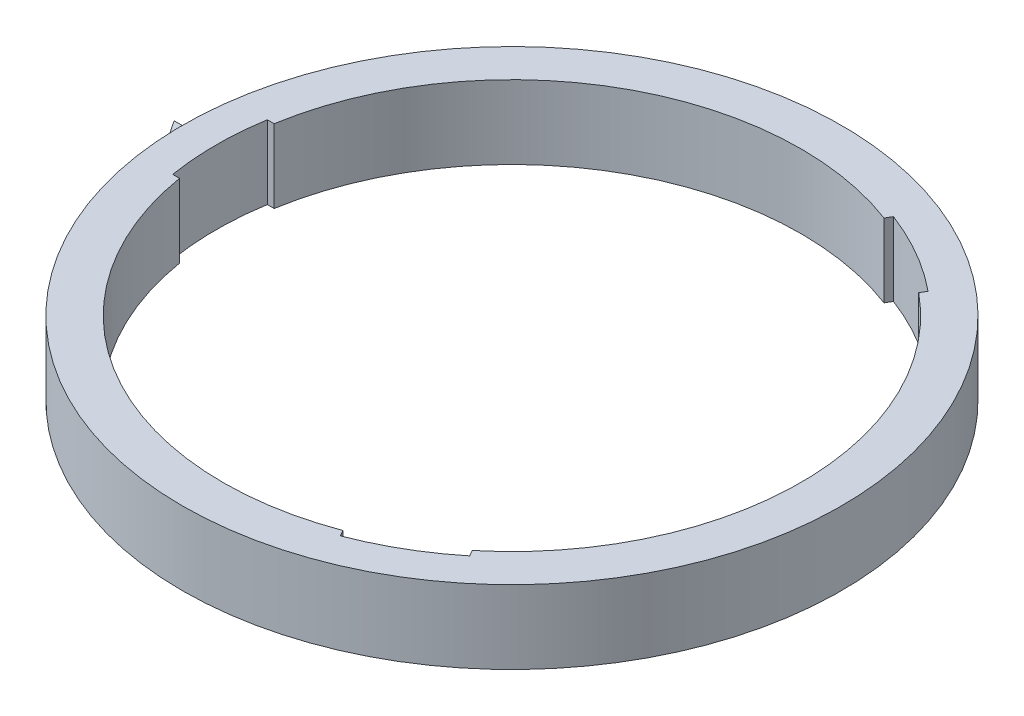
ISO-10303-21;
HEADER;
FILE_DESCRIPTION(('STEP AP214'),'2;1');
FILE_NAME('part.step','',(''),(''),'','','');
FILE_SCHEMA(('AUTOMOTIVE_DESIGN { 1 0 10303 214 1 1 1 1 }'));
ENDSEC;
DATA;
#1=APPLICATION_CONTEXT('core data for automotive mechanical design processes');
#2=APPLICATION_PROTOCOL_DEFINITION('international standard','automotive_design',2000,#1);
#3=PRODUCT_CONTEXT('',#1,'mechanical');
#4=PRODUCT('Part','Part','',(#3));
#5=PRODUCT_RELATED_PRODUCT_CATEGORY('part','',(#4));
#6=PRODUCT_DEFINITION_FORMATION('','',#4);
#7=PRODUCT_DEFINITION_CONTEXT('part definition',#1,'design');
#8=PRODUCT_DEFINITION('design','',#6,#7);
#9=PRODUCT_DEFINITION_SHAPE('','',#8);
#10=(LENGTH_UNIT() NAMED_UNIT(*) SI_UNIT(.MILLI.,.METRE.));
#11=(NAMED_UNIT(*) PLANE_ANGLE_UNIT() SI_UNIT($,.RADIAN.));
#12=(NAMED_UNIT(*) SI_UNIT($,.STERADIAN.) SOLID_ANGLE_UNIT());
#13=UNCERTAINTY_MEASURE_WITH_UNIT(LENGTH_MEASURE(1.E-05),#10,'distance_accuracy_value','');
#14=(GEOMETRIC_REPRESENTATION_CONTEXT(3) GLOBAL_UNCERTAINTY_ASSIGNED_CONTEXT((#13)) GLOBAL_UNIT_ASSIGNED_CONTEXT((#10,
#11,#12)) REPRESENTATION_CONTEXT('',''));
#15=CARTESIAN_POINT('',(0.,0.,0.));
#16=DIRECTION('',(0.,0.,1.));
#17=DIRECTION('',(1.,0.,0.));
#18=AXIS2_PLACEMENT_3D('',#15,#16,#17);
#19=CARTESIAN_POINT('',(0.,4.34782608695652,0.));
#20=DIRECTION('',(0.,-1.,0.));
#21=DIRECTION('',(0.,0.,-1.));
#22=AXIS2_PLACEMENT_3D('',#19,#20,#21);
#23=CYLINDRICAL_SURFACE('',#22,17.1);
#24=DIRECTION('',(0.,-1.,0.));
#25=VECTOR('',#24,1.);
#26=CARTESIAN_POINT('',(-16.8692027078935,4.34782608695652,-2.8));
#27=LINE('',#26,#25);
#28=CARTESIAN_POINT('',(-16.8692027078935,0.,-2.8));
#29=VERTEX_POINT('',#28);
#30=CARTESIAN_POINT('',(-16.8692027078935,4.34782608695652,-2.8));
#31=VERTEX_POINT('',#30);
#32=EDGE_CURVE('E11',#29,#31,#27,.F.);
#33=ORIENTED_EDGE('',*,*,#32,.F.);
#34=CARTESIAN_POINT('',(0.,0.,0.));
#35=DIRECTION('',(0.,1.,0.));
#36=DIRECTION('',(0.,0.,1.));
#37=AXIS2_PLACEMENT_3D('',#34,#35,#36);
#38=CIRCLE('',#37,17.1);
#39=CARTESIAN_POINT('',(6.0097302233503,0.,-16.009158086625));
#40=VERTEX_POINT('',#39);
#41=EDGE_CURVE('E246',#40,#29,#38,.T.);
#42=ORIENTED_EDGE('',*,*,#41,.F.);
#43=DIRECTION('',(0.,-1.,0.));
#44=VECTOR('',#43,1.);
#45=CARTESIAN_POINT('',(6.0097302233503,4.34782608695652,-16.009158086625));
#46=LINE('',#45,#44);
#47=CARTESIAN_POINT('',(6.0097302233503,4.34782608695652,-16.009158086625));
#48=VERTEX_POINT('',#47);
#49=EDGE_CURVE('E295',#48,#40,#46,.T.);
#50=ORIENTED_EDGE('',*,*,#49,.F.);
#51=CARTESIAN_POINT('',(0.,4.34782608695652,0.));
#52=DIRECTION('',(0.,1.,0.));
#53=DIRECTION('',(0.,0.,1.));
#54=AXIS2_PLACEMENT_3D('',#51,#52,#53);
#55=CIRCLE('',#54,17.1);
#56=EDGE_CURVE('E242',#48,#31,#55,.T.);
#57=ORIENTED_EDGE('',*,*,#56,.T.);
#58=EDGE_LOOP('',(#33,#42,#50,#57));
#59=FACE_BOUND('',#58,.T.);
#60=ADVANCED_FACE('F34',(#59),#23,.F.);
#61=DIRECTION('',(0.,-1.,0.));
#62=VECTOR('',#61,1.);
#63=CARTESIAN_POINT('',(10.8594724845432,4.34782608695652,-13.209158086625));
#64=LINE('',#63,#62);
#65=CARTESIAN_POINT('',(10.8594724845432,0.,-13.209158086625));
#66=VERTEX_POINT('',#65);
#67=CARTESIAN_POINT('',(10.8594724845432,4.34782608695652,-13.209158086625));
#68=VERTEX_POINT('',#67);
#69=EDGE_CURVE('E297',#66,#68,#64,.F.);
#70=ORIENTED_EDGE('',*,*,#69,.F.);
#71=CARTESIAN_POINT('',(10.8594724845432,0.,13.209158086625));
#72=VERTEX_POINT('',#71);
#73=EDGE_CURVE('E243',#72,#66,#38,.T.);
#74=ORIENTED_EDGE('',*,*,#73,.F.);
#75=DIRECTION('',(0.,-1.,0.));
#76=VECTOR('',#75,1.);
#77=CARTESIAN_POINT('',(10.8594724845432,4.34782608695652,13.209158086625));
#78=LINE('',#77,#76);
#79=CARTESIAN_POINT('',(10.8594724845432,4.34782608695652,13.209158086625));
#80=VERTEX_POINT('',#79);
#81=EDGE_CURVE('E283',#80,#72,#78,.T.);
#82=ORIENTED_EDGE('',*,*,#81,.F.);
#83=EDGE_CURVE('E244',#80,#68,#55,.T.);
#84=ORIENTED_EDGE('',*,*,#83,.T.);
#85=EDGE_LOOP('',(#70,#74,#82,#84));
#86=FACE_BOUND('',#85,.T.);
#87=ADVANCED_FACE('F314',(#86),#23,.F.);
#88=CARTESIAN_POINT('',(0.,4.34782608695652,0.));
#89=DIRECTION('',(0.,-1.,0.));
#90=DIRECTION('',(0.,0.,-1.));
#91=AXIS2_PLACEMENT_3D('',#88,#89,#90);
#92=CYLINDRICAL_SURFACE('',#91,19.5);
#93=CARTESIAN_POINT('',(0.,0.,0.));
#94=DIRECTION('',(0.,1.,0.));
#95=DIRECTION('',(0.,0.,1.));
#96=AXIS2_PLACEMENT_3D('',#93,#94,#95);
#97=CIRCLE('',#96,19.5);
#98=CARTESIAN_POINT('',(0.,0.,19.5));
#99=VERTEX_POINT('',#98);
#100=EDGE_CURVE('E251',#99,#99,#97,.T.);
#101=ORIENTED_EDGE('',*,*,#100,.T.);
#102=EDGE_LOOP('',(#101));
#103=FACE_BOUND('',#102,.T.);
#104=CARTESIAN_POINT('',(0.,4.34782608695652,0.));
#105=DIRECTION('',(0.,1.,0.));
#106=DIRECTION('',(0.,0.,1.));
#107=AXIS2_PLACEMENT_3D('',#104,#105,#106);
#108=CIRCLE('',#107,19.5);
#109=CARTESIAN_POINT('',(0.,4.34782608695652,19.5));
#110=VERTEX_POINT('',#109);
#111=EDGE_CURVE('E247',#110,#110,#108,.T.);
#112=ORIENTED_EDGE('',*,*,#111,.F.);
#113=EDGE_LOOP('',(#112));
#114=FACE_BOUND('',#113,.T.);
#115=CARTESIAN_POINT('',(0.,4.33854182700951,0.));
#116=DIRECTION('',(0.,-0.448746127925553,0.893659282205373));
#117=DIRECTION('',(0.,-0.893659282205373,-0.448746127925553));
#118=AXIS2_PLACEMENT_3D('',#115,#116,#117);
#119=ELLIPSE('',#118,43.4544139470214,19.5);
#120=CARTESIAN_POINT('',(-19.5,4.33854182700951,0.));
#121=VERTEX_POINT('',#120);
#122=CARTESIAN_POINT('',(-19.4696822141464,2.17391304347826,-1.08695652173914));
#123=VERTEX_POINT('',#122);
#124=EDGE_CURVE('E262',#121,#123,#119,.T.);
#125=ORIENTED_EDGE('',*,*,#124,.F.);
#126=CARTESIAN_POINT('',(0.,4.33854182700951,0.));
#127=DIRECTION('',(0.,-0.448746127925553,-0.893659282205373));
#128=DIRECTION('',(0.,-0.893659282205373,0.448746127925553));
#129=AXIS2_PLACEMENT_3D('',#126,#127,#128);
#130=ELLIPSE('',#129,43.4544139470214,19.5);
#131=CARTESIAN_POINT('',(-19.4696822141464,2.17391304347826,1.08695652173914));
#132=VERTEX_POINT('',#131);
#133=EDGE_CURVE('E250',#132,#121,#130,.T.);
#134=ORIENTED_EDGE('',*,*,#133,.F.);
#135=CARTESIAN_POINT('',(0.,0.00928425994700752,0.));
#136=DIRECTION('',(0.,0.448746127925553,-0.893659282205373));
#137=DIRECTION('',(0.,-0.893659282205373,-0.448746127925553));
#138=AXIS2_PLACEMENT_3D('',#135,#136,#137);
#139=ELLIPSE('',#138,43.4544139470214,19.5);
#140=CARTESIAN_POINT('',(-19.5,0.00928425994700806,0.));
#141=VERTEX_POINT('',#140);
#142=EDGE_CURVE('E256',#141,#132,#139,.T.);
#143=ORIENTED_EDGE('',*,*,#142,.F.);
#144=CARTESIAN_POINT('',(0.,0.00928425994700839,0.));
#145=DIRECTION('',(0.,0.448746127925553,0.893659282205373));
#146=DIRECTION('',(0.,-0.893659282205373,0.448746127925553));
#147=AXIS2_PLACEMENT_3D('',#144,#145,#146);
#148=ELLIPSE('',#147,43.4544139470214,19.5);
#149=EDGE_CURVE('E259',#123,#141,#148,.T.);
#150=ORIENTED_EDGE('',*,*,#149,.F.);
#151=EDGE_LOOP('',(#125,#134,#143,#150));
#152=FACE_BOUND('',#151,.T.);
#153=ADVANCED_FACE('F337',(#103,#114,#152),#92,.T.);
#154=CARTESIAN_POINT('',(0.,4.34782608695652,0.));
#155=DIRECTION('',(0.,1.,0.));
#156=DIRECTION('',(0.,0.,1.));
#157=AXIS2_PLACEMENT_3D('',#154,#155,#156);
#158=PLANE('',#157);
#159=DIRECTION('',(-1.,0.,0.));
#160=VECTOR('',#159,1.);
#161=CARTESIAN_POINT('',(-17.2745477509543,4.34782608695652,-2.8));
#162=LINE('',#161,#160);
#163=CARTESIAN_POINT('',(-17.2745477509543,4.34782608695652,-2.8));
#164=VERTEX_POINT('',#163);
#165=EDGE_CURVE('E179',#31,#164,#162,.T.);
#166=ORIENTED_EDGE('',*,*,#165,.F.);
#167=ORIENTED_EDGE('',*,*,#56,.F.);
#168=DIRECTION('',(-0.5,0.,0.866025403784439));
#169=VECTOR('',#168,1.);
#170=CARTESIAN_POINT('',(6.21240274488071,4.34782608695652,-16.3601971912138));
#171=LINE('',#170,#169);
#172=CARTESIAN_POINT('',(6.21240274488071,4.34782608695652,-16.3601971912138));
#173=VERTEX_POINT('',#172);
#174=EDGE_CURVE('E57',#173,#48,#171,.T.);
#175=ORIENTED_EDGE('',*,*,#174,.F.);
#176=CARTESIAN_POINT('',(0.,4.34782608695652,0.));
#177=DIRECTION('',(0.,1.,0.));
#178=DIRECTION('',(0.,0.,1.));
#179=AXIS2_PLACEMENT_3D('',#176,#177,#178);
#180=CIRCLE('',#179,17.5);
#181=CARTESIAN_POINT('',(11.0621450060736,4.34782608695652,-13.5601971912138));
#182=VERTEX_POINT('',#181);
#183=EDGE_CURVE('E200',#182,#173,#180,.T.);
#184=ORIENTED_EDGE('',*,*,#183,.F.);
#185=DIRECTION('',(0.5,0.,-0.866025403784439));
#186=VECTOR('',#185,1.);
#187=CARTESIAN_POINT('',(11.0621450060736,4.34782608695652,-13.5601971912138));
#188=LINE('',#187,#186);
#189=EDGE_CURVE('E193',#68,#182,#188,.T.);
#190=ORIENTED_EDGE('',*,*,#189,.F.);
#191=ORIENTED_EDGE('',*,*,#83,.F.);
#192=DIRECTION('',(-0.5,0.,-0.866025403784439));
#193=VECTOR('',#192,1.);
#194=CARTESIAN_POINT('',(11.0621450060736,4.34782608695652,13.5601971912138));
#195=LINE('',#194,#193);
#196=CARTESIAN_POINT('',(11.0621450060736,4.34782608695652,13.5601971912138));
#197=VERTEX_POINT('',#196);
#198=EDGE_CURVE('E223',#197,#80,#195,.T.);
#199=ORIENTED_EDGE('',*,*,#198,.F.);
#200=CARTESIAN_POINT('',(0.,4.34782608695652,0.));
#201=DIRECTION('',(0.,1.,0.));
#202=DIRECTION('',(0.,0.,1.));
#203=AXIS2_PLACEMENT_3D('',#200,#201,#202);
#204=CIRCLE('',#203,17.5);
#205=CARTESIAN_POINT('',(6.21240274488073,4.34782608695652,16.3601971912138));
#206=VERTEX_POINT('',#205);
#207=EDGE_CURVE('E220',#206,#197,#204,.T.);
#208=ORIENTED_EDGE('',*,*,#207,.F.);
#209=DIRECTION('',(0.5,0.,0.866025403784439));
#210=VECTOR('',#209,1.);
#211=CARTESIAN_POINT('',(6.21240274488073,4.34782608695652,16.3601971912138));
#212=LINE('',#211,#210);
#213=CARTESIAN_POINT('',(6.00973022335031,4.34782608695652,16.009158086625));
#214=VERTEX_POINT('',#213);
#215=EDGE_CURVE('E213',#214,#206,#212,.T.);
#216=ORIENTED_EDGE('',*,*,#215,.F.);
#217=CARTESIAN_POINT('',(-16.8692027078935,4.34782608695652,2.8));
#218=VERTEX_POINT('',#217);
#219=EDGE_CURVE('E239',#218,#214,#55,.T.);
#220=ORIENTED_EDGE('',*,*,#219,.F.);
#221=DIRECTION('',(1.,0.,0.));
#222=VECTOR('',#221,1.);
#223=CARTESIAN_POINT('',(-17.2745477509543,4.34782608695652,2.8));
#224=LINE('',#223,#222);
#225=CARTESIAN_POINT('',(-17.2745477509543,4.34782608695652,2.8));
#226=VERTEX_POINT('',#225);
#227=EDGE_CURVE('E49',#226,#218,#224,.T.);
#228=ORIENTED_EDGE('',*,*,#227,.F.);
#229=CARTESIAN_POINT('',(0.,4.34782608695652,0.));
#230=DIRECTION('',(0.,1.,0.));
#231=DIRECTION('',(0.,0.,1.));
#232=AXIS2_PLACEMENT_3D('',#229,#230,#231);
#233=CIRCLE('',#232,17.5);
#234=EDGE_CURVE('E166',#164,#226,#233,.T.);
#235=ORIENTED_EDGE('',*,*,#234,.F.);
#236=EDGE_LOOP('',(#166,#167,#175,#184,#190,#191,#199,#208,#216,#220,#228,#235));
#237=FACE_BOUND('',#236,.T.);
#238=ORIENTED_EDGE('',*,*,#111,.T.);
#239=EDGE_LOOP('',(#238));
#240=FACE_BOUND('',#239,.T.);
#241=ADVANCED_FACE('F310',(#237,#240),#158,.T.);
#242=CARTESIAN_POINT('',(0.,0.,0.));
#243=DIRECTION('',(0.,1.,0.));
#244=DIRECTION('',(0.,0.,1.));
#245=AXIS2_PLACEMENT_3D('',#242,#243,#244);
#246=PLANE('',#245);
#247=ORIENTED_EDGE('',*,*,#100,.F.);
#248=EDGE_LOOP('',(#247));
#249=FACE_BOUND('',#248,.T.);
#250=ORIENTED_EDGE('',*,*,#41,.T.);
#251=DIRECTION('',(-1.,0.,0.));
#252=VECTOR('',#251,1.);
#253=CARTESIAN_POINT('',(-17.2745477509543,0.,-2.8));
#254=LINE('',#253,#252);
#255=CARTESIAN_POINT('',(-17.2745477509543,0.,-2.8));
#256=VERTEX_POINT('',#255);
#257=EDGE_CURVE('E168',#29,#256,#254,.T.);
#258=ORIENTED_EDGE('',*,*,#257,.T.);
#259=CARTESIAN_POINT('',(0.,0.,0.));
#260=DIRECTION('',(0.,1.,0.));
#261=DIRECTION('',(0.,0.,1.));
#262=AXIS2_PLACEMENT_3D('',#259,#260,#261);
#263=CIRCLE('',#262,17.5);
#264=CARTESIAN_POINT('',(-17.2745477509543,0.,2.8));
#265=VERTEX_POINT('',#264);
#266=EDGE_CURVE('E163',#256,#265,#263,.T.);
#267=ORIENTED_EDGE('',*,*,#266,.T.);
#268=DIRECTION('',(1.,0.,0.));
#269=VECTOR('',#268,1.);
#270=CARTESIAN_POINT('',(-17.2745477509543,0.,2.8));
#271=LINE('',#270,#269);
#272=CARTESIAN_POINT('',(-16.8692027078935,0.,2.8));
#273=VERTEX_POINT('',#272);
#274=EDGE_CURVE('E171',#265,#273,#271,.T.);
#275=ORIENTED_EDGE('',*,*,#274,.T.);
#276=CARTESIAN_POINT('',(6.00973022335031,0.,16.009158086625));
#277=VERTEX_POINT('',#276);
#278=EDGE_CURVE('E238',#273,#277,#38,.T.);
#279=ORIENTED_EDGE('',*,*,#278,.T.);
#280=DIRECTION('',(0.5,0.,0.866025403784439));
#281=VECTOR('',#280,1.);
#282=CARTESIAN_POINT('',(6.21240274488073,0.,16.3601971912138));
#283=LINE('',#282,#281);
#284=CARTESIAN_POINT('',(6.21240274488073,0.,16.3601971912138));
#285=VERTEX_POINT('',#284);
#286=EDGE_CURVE('E216',#277,#285,#283,.T.);
#287=ORIENTED_EDGE('',*,*,#286,.T.);
#288=CARTESIAN_POINT('',(0.,0.,0.));
#289=DIRECTION('',(0.,1.,0.));
#290=DIRECTION('',(0.,0.,1.));
#291=AXIS2_PLACEMENT_3D('',#288,#289,#290);
#292=CIRCLE('',#291,17.5);
#293=CARTESIAN_POINT('',(11.0621450060736,0.,13.5601971912138));
#294=VERTEX_POINT('',#293);
#295=EDGE_CURVE('E209',#285,#294,#292,.T.);
#296=ORIENTED_EDGE('',*,*,#295,.T.);
#297=DIRECTION('',(-0.5,0.,-0.866025403784439));
#298=VECTOR('',#297,1.);
#299=CARTESIAN_POINT('',(11.0621450060736,0.,13.5601971912138));
#300=LINE('',#299,#298);
#301=EDGE_CURVE('E212',#294,#72,#300,.T.);
#302=ORIENTED_EDGE('',*,*,#301,.T.);
#303=ORIENTED_EDGE('',*,*,#73,.T.);
#304=DIRECTION('',(0.5,0.,-0.866025403784439));
#305=VECTOR('',#304,1.);
#306=CARTESIAN_POINT('',(11.0621450060736,0.,-13.5601971912138));
#307=LINE('',#306,#305);
#308=CARTESIAN_POINT('',(11.0621450060736,0.,-13.5601971912138));
#309=VERTEX_POINT('',#308);
#310=EDGE_CURVE('E196',#66,#309,#307,.T.);
#311=ORIENTED_EDGE('',*,*,#310,.T.);
#312=CARTESIAN_POINT('',(0.,0.,0.));
#313=DIRECTION('',(0.,1.,0.));
#314=DIRECTION('',(0.,0.,1.));
#315=AXIS2_PLACEMENT_3D('',#312,#313,#314);
#316=CIRCLE('',#315,17.5);
#317=CARTESIAN_POINT('',(6.21240274488071,0.,-16.3601971912138));
#318=VERTEX_POINT('',#317);
#319=EDGE_CURVE('E189',#309,#318,#316,.T.);
#320=ORIENTED_EDGE('',*,*,#319,.T.);
#321=DIRECTION('',(-0.5,0.,0.866025403784439));
#322=VECTOR('',#321,1.);
#323=CARTESIAN_POINT('',(6.21240274488071,0.,-16.3601971912138));
#324=LINE('',#323,#322);
#325=EDGE_CURVE('E192',#318,#40,#324,.T.);
#326=ORIENTED_EDGE('',*,*,#325,.T.);
#327=EDGE_LOOP('',(#250,#258,#267,#275,#279,#287,#296,#302,#303,#311,#320,#326));
#328=FACE_BOUND('',#327,.T.);
#329=ADVANCED_FACE('F178',(#249,#328),#246,.F.);
#330=DIRECTION('',(0.,-1.,0.));
#331=VECTOR('',#330,1.);
#332=CARTESIAN_POINT('',(-16.8692027078935,4.34782608695652,2.8));
#333=LINE('',#332,#331);
#334=EDGE_CURVE('E42',#218,#273,#333,.T.);
#335=ORIENTED_EDGE('',*,*,#334,.F.);
#336=ORIENTED_EDGE('',*,*,#219,.T.);
#337=DIRECTION('',(0.,-1.,0.));
#338=VECTOR('',#337,1.);
#339=CARTESIAN_POINT('',(6.00973022335031,4.34782608695652,16.009158086625));
#340=LINE('',#339,#338);
#341=EDGE_CURVE('E293',#277,#214,#340,.F.);
#342=ORIENTED_EDGE('',*,*,#341,.F.);
#343=ORIENTED_EDGE('',*,*,#278,.F.);
#344=EDGE_LOOP('',(#335,#336,#342,#343));
#345=FACE_BOUND('',#344,.T.);
#346=ADVANCED_FACE('F333',(#345),#23,.F.);
#347=CARTESIAN_POINT('',(-20.58695652,4.33854182700951,0.));
#348=DIRECTION('',(0.,-0.448746127925553,0.893659282205373));
#349=DIRECTION('',(0.,-0.893659282205373,-0.448746127925553));
#350=AXIS2_PLACEMENT_3D('',#347,#348,#349);
#351=PLANE('',#350);
#352=DIRECTION('',(1.,0.,0.));
#353=VECTOR('',#352,1.);
#354=CARTESIAN_POINT('',(-20.58695652,2.17391304347826,-1.08695652173914));
#355=LINE('',#354,#353);
#356=CARTESIAN_POINT('',(-19.98695652,2.17391304347826,-1.08695652173914));
#357=VERTEX_POINT('',#356);
#358=EDGE_CURVE('E236',#357,#123,#355,.T.);
#359=ORIENTED_EDGE('',*,*,#358,.F.);
#360=DIRECTION('',(0.,0.893659282205373,0.448746127925553));
#361=VECTOR('',#360,1.);
#362=CARTESIAN_POINT('',(-19.98695652,4.33854182700951,0.));
#363=LINE('',#362,#361);
#364=CARTESIAN_POINT('',(-19.98695652,4.33854182700951,0.));
#365=VERTEX_POINT('',#364);
#366=EDGE_CURVE('E281',#357,#365,#363,.T.);
#367=ORIENTED_EDGE('',*,*,#366,.T.);
#368=DIRECTION('',(1.,0.,0.));
#369=VECTOR('',#368,1.);
#370=CARTESIAN_POINT('',(-20.58695652,4.33854182700951,0.));
#371=LINE('',#370,#369);
#372=EDGE_CURVE('E229',#365,#121,#371,.T.);
#373=ORIENTED_EDGE('',*,*,#372,.T.);
#374=ORIENTED_EDGE('',*,*,#124,.T.);
#375=EDGE_LOOP('',(#359,#367,#373,#374));
#376=FACE_BOUND('',#375,.T.);
#377=ADVANCED_FACE('F341',(#376),#351,.F.);
#378=CARTESIAN_POINT('',(-20.58695652,0.00928425994700806,0.));
#379=DIRECTION('',(0.,0.448746127925553,0.893659282205373));
#380=DIRECTION('',(0.,-0.893659282205373,0.448746127925553));
#381=AXIS2_PLACEMENT_3D('',#378,#379,#380);
#382=PLANE('',#381);
#383=DIRECTION('',(1.,0.,0.));
#384=VECTOR('',#383,1.);
#385=CARTESIAN_POINT('',(-20.58695652,0.00928425994700806,0.));
#386=LINE('',#385,#384);
#387=CARTESIAN_POINT('',(-19.98695652,0.00928425994700806,0.));
#388=VERTEX_POINT('',#387);
#389=EDGE_CURVE('E234',#388,#141,#386,.T.);
#390=ORIENTED_EDGE('',*,*,#389,.F.);
#391=DIRECTION('',(0.,0.893659282205373,-0.448746127925553));
#392=VECTOR('',#391,1.);
#393=CARTESIAN_POINT('',(-19.98695652,0.00928425994700806,0.));
#394=LINE('',#393,#392);
#395=EDGE_CURVE('E279',#388,#357,#394,.T.);
#396=ORIENTED_EDGE('',*,*,#395,.T.);
#397=ORIENTED_EDGE('',*,*,#358,.T.);
#398=ORIENTED_EDGE('',*,*,#149,.T.);
#399=EDGE_LOOP('',(#390,#396,#397,#398));
#400=FACE_BOUND('',#399,.T.);
#401=ADVANCED_FACE('F347',(#400),#382,.F.);
#402=CARTESIAN_POINT('',(-20.58695652,2.17391304347826,1.08695652173914));
#403=DIRECTION('',(0.,0.448746127925553,-0.893659282205373));
#404=DIRECTION('',(0.,0.893659282205373,0.448746127925553));
#405=AXIS2_PLACEMENT_3D('',#402,#403,#404);
#406=PLANE('',#405);
#407=DIRECTION('',(1.,0.,0.));
#408=VECTOR('',#407,1.);
#409=CARTESIAN_POINT('',(-20.58695652,2.17391304347826,1.08695652173914));
#410=LINE('',#409,#408);
#411=CARTESIAN_POINT('',(-19.98695652,2.17391304347826,1.08695652173914));
#412=VERTEX_POINT('',#411);
#413=EDGE_CURVE('E231',#412,#132,#410,.T.);
#414=ORIENTED_EDGE('',*,*,#413,.F.);
#415=DIRECTION('',(0.,-0.893659282205373,-0.448746127925553));
#416=VECTOR('',#415,1.);
#417=CARTESIAN_POINT('',(-19.98695652,2.17391304347826,1.08695652173914));
#418=LINE('',#417,#416);
#419=EDGE_CURVE('E277',#412,#388,#418,.T.);
#420=ORIENTED_EDGE('',*,*,#419,.T.);
#421=ORIENTED_EDGE('',*,*,#389,.T.);
#422=ORIENTED_EDGE('',*,*,#142,.T.);
#423=EDGE_LOOP('',(#414,#420,#421,#422));
#424=FACE_BOUND('',#423,.T.);
#425=ADVANCED_FACE('F389',(#424),#406,.F.);
#426=CARTESIAN_POINT('',(-20.58695652,2.17391304347826,1.08695652173914));
#427=DIRECTION('',(0.,-0.448746127925553,-0.893659282205373));
#428=DIRECTION('',(0.,0.893659282205373,-0.448746127925553));
#429=AXIS2_PLACEMENT_3D('',#426,#427,#428);
#430=PLANE('',#429);
#431=ORIENTED_EDGE('',*,*,#372,.F.);
#432=DIRECTION('',(0.,-0.893659282205373,0.448746127925553));
#433=VECTOR('',#432,1.);
#434=CARTESIAN_POINT('',(-19.98695652,2.17391304347826,1.08695652173914));
#435=LINE('',#434,#433);
#436=EDGE_CURVE('E274',#365,#412,#435,.T.);
#437=ORIENTED_EDGE('',*,*,#436,.T.);
#438=ORIENTED_EDGE('',*,*,#413,.T.);
#439=ORIENTED_EDGE('',*,*,#133,.T.);
#440=EDGE_LOOP('',(#431,#437,#438,#439));
#441=FACE_BOUND('',#440,.T.);
#442=ADVANCED_FACE('F385',(#441),#430,.F.);
#443=CARTESIAN_POINT('',(-20.58695652,0.,0.));
#444=DIRECTION('',(1.,0.,0.));
#445=DIRECTION('',(0.,0.,-1.));
#446=AXIS2_PLACEMENT_3D('',#443,#444,#445);
#447=PLANE('',#446);
#448=DIRECTION('',(0.,0.893659282205373,0.448746127925553));
#449=VECTOR('',#448,1.);
#450=CARTESIAN_POINT('',(-20.58695652,0.4376020903048,-0.871466393974626));
#451=LINE('',#450,#449);
#452=CARTESIAN_POINT('',(-20.58695652,2.17309123136023,0.));
#453=VERTEX_POINT('',#452);
#454=CARTESIAN_POINT('',(-20.58695652,2.17391304347826,0.000412668466820911));
#455=VERTEX_POINT('',#454);
#456=EDGE_CURVE('E269',#453,#455,#451,.T.);
#457=ORIENTED_EDGE('',*,*,#456,.T.);
#458=DIRECTION('',(0.,0.893659282205373,-0.448746127925553));
#459=VECTOR('',#458,1.);
#460=CARTESIAN_POINT('',(-20.58695652,0.437933071991623,0.872125530261855));
#461=LINE('',#460,#459);
#462=CARTESIAN_POINT('',(-20.58695652,2.17473485559629,0.));
#463=VERTEX_POINT('',#462);
#464=EDGE_CURVE('E271',#455,#463,#461,.T.);
#465=ORIENTED_EDGE('',*,*,#464,.T.);
#466=DIRECTION('',(0.,-0.893659282205373,-0.448746127925553));
#467=VECTOR('',#466,1.);
#468=CARTESIAN_POINT('',(-20.58695652,0.437933071991622,-0.872125530261855));
#469=LINE('',#468,#467);
#470=CARTESIAN_POINT('',(-20.58695652,2.17391304347826,-0.000412668466821087));
#471=VERTEX_POINT('',#470);
#472=EDGE_CURVE('E265',#463,#471,#469,.T.);
#473=ORIENTED_EDGE('',*,*,#472,.T.);
#474=DIRECTION('',(0.,-0.893659282205373,0.448746127925553));
#475=VECTOR('',#474,1.);
#476=CARTESIAN_POINT('',(-20.58695652,0.4376020903048,0.871466393974626));
#477=LINE('',#476,#475);
#478=EDGE_CURVE('E267',#471,#453,#477,.T.);
#479=ORIENTED_EDGE('',*,*,#478,.T.);
#480=EDGE_LOOP('',(#457,#465,#473,#479));
#481=FACE_BOUND('',#480,.T.);
#482=ADVANCED_FACE('F382',(#481),#447,.F.);
#483=CARTESIAN_POINT('',(-20.58695652,0.4376020903048,0.871466393974626));
#484=DIRECTION('',(0.850694296932989,0.235888221501768,0.469761599242021));
#485=DIRECTION('',(0.,-0.893659282205373,0.448746127925553));
#486=AXIS2_PLACEMENT_3D('',#483,#484,#485);
#487=PLANE('',#486);
#488=DIRECTION('',(-0.483403141747335,0.,0.875397853863491));
#489=VECTOR('',#488,1.);
#490=CARTESIAN_POINT('',(-20.2180737247817,2.17391304347826,-0.668424891337425));
#491=LINE('',#490,#489);
#492=EDGE_CURVE('E287',#357,#471,#491,.T.);
#493=ORIENTED_EDGE('',*,*,#492,.F.);
#494=ORIENTED_EDGE('',*,*,#395,.F.);
#495=DIRECTION('',(-0.267206623633739,0.963639258377458,0.));
#496=VECTOR('',#495,1.);
#497=CARTESIAN_POINT('',(-20.1400840454655,0.561514938476094,0.));
#498=LINE('',#497,#496);
#499=EDGE_CURVE('E232',#453,#388,#498,.F.);
#500=ORIENTED_EDGE('',*,*,#499,.F.);
#501=ORIENTED_EDGE('',*,*,#478,.F.);
#502=EDGE_LOOP('',(#493,#494,#500,#501));
#503=FACE_BOUND('',#502,.T.);
#504=ADVANCED_FACE('F36',(#503),#487,.F.);
#505=CARTESIAN_POINT('',(-20.58695652,0.4376020903048,-0.871466393974626));
#506=DIRECTION('',(0.850694296932989,0.235888221501768,-0.469761599242021));
#507=DIRECTION('',(0.,0.893659282205373,0.448746127925553));
#508=AXIS2_PLACEMENT_3D('',#505,#506,#507);
#509=PLANE('',#508);
#510=ORIENTED_EDGE('',*,*,#499,.T.);
#511=ORIENTED_EDGE('',*,*,#419,.F.);
#512=DIRECTION('',(-0.483403141747335,0.,-0.875397853863491));
#513=VECTOR('',#512,1.);
#514=CARTESIAN_POINT('',(-20.955909646358,2.17391304347826,-0.667726917516247));
#515=LINE('',#514,#513);
#516=EDGE_CURVE('E285',#455,#412,#515,.F.);
#517=ORIENTED_EDGE('',*,*,#516,.F.);
#518=ORIENTED_EDGE('',*,*,#456,.F.);
#519=EDGE_LOOP('',(#510,#511,#517,#518));
#520=FACE_BOUND('',#519,.T.);
#521=ADVANCED_FACE('F411',(#520),#509,.F.);
#522=CARTESIAN_POINT('',(-20.58695652,0.437933071991622,-0.872125530261855));
#523=DIRECTION('',(0.850694296932989,-0.235888221501768,0.469761599242021));
#524=DIRECTION('',(0.,-0.893659282205373,-0.448746127925553));
#525=AXIS2_PLACEMENT_3D('',#522,#523,#524);
#526=PLANE('',#525);
#527=ORIENTED_EDGE('',*,*,#492,.T.);
#528=ORIENTED_EDGE('',*,*,#472,.F.);
#529=DIRECTION('',(0.267206623633739,0.963639258377458,0.));
#530=VECTOR('',#529,1.);
#531=CARTESIAN_POINT('',(-21.034166987905,0.561939642026718,0.));
#532=LINE('',#531,#530);
#533=EDGE_CURVE('E187',#365,#463,#532,.F.);
#534=ORIENTED_EDGE('',*,*,#533,.F.);
#535=ORIENTED_EDGE('',*,*,#366,.F.);
#536=EDGE_LOOP('',(#527,#528,#534,#535));
#537=FACE_BOUND('',#536,.T.);
#538=ADVANCED_FACE('F416',(#537),#526,.F.);
#539=CARTESIAN_POINT('',(-20.58695652,0.437933071991622,0.872125530261855));
#540=DIRECTION('',(0.850694296932988,-0.235888221501768,-0.469761599242021));
#541=DIRECTION('',(0.,0.893659282205373,-0.448746127925553));
#542=AXIS2_PLACEMENT_3D('',#539,#540,#541);
#543=PLANE('',#542);
#544=ORIENTED_EDGE('',*,*,#516,.T.);
#545=ORIENTED_EDGE('',*,*,#436,.F.);
#546=ORIENTED_EDGE('',*,*,#533,.T.);
#547=ORIENTED_EDGE('',*,*,#464,.F.);
#548=EDGE_LOOP('',(#544,#545,#546,#547));
#549=FACE_BOUND('',#548,.T.);
#550=ADVANCED_FACE('F381',(#549),#543,.F.);
#551=CARTESIAN_POINT('',(0.,0.,0.));
#552=DIRECTION('',(0.,1.,0.));
#553=DIRECTION('',(0.,0.,1.));
#554=AXIS2_PLACEMENT_3D('',#551,#552,#553);
#555=CYLINDRICAL_SURFACE('',#554,17.5);
#556=ORIENTED_EDGE('',*,*,#207,.T.);
#557=DIRECTION('',(0.,1.,0.));
#558=VECTOR('',#557,1.);
#559=CARTESIAN_POINT('',(11.0621450060736,0.,13.5601971912138));
#560=LINE('',#559,#558);
#561=EDGE_CURVE('E219',#294,#197,#560,.T.);
#562=ORIENTED_EDGE('',*,*,#561,.F.);
#563=ORIENTED_EDGE('',*,*,#295,.F.);
#564=DIRECTION('',(0.,1.,0.));
#565=VECTOR('',#564,1.);
#566=CARTESIAN_POINT('',(6.21240274488073,0.,16.3601971912138));
#567=LINE('',#566,#565);
#568=EDGE_CURVE('E203',#285,#206,#567,.T.);
#569=ORIENTED_EDGE('',*,*,#568,.T.);
#570=EDGE_LOOP('',(#556,#562,#563,#569));
#571=FACE_BOUND('',#570,.T.);
#572=ADVANCED_FACE('F359',(#571),#555,.F.);
#573=CARTESIAN_POINT('',(6.21240274488073,0.,16.3601971912138));
#574=DIRECTION('',(-0.866025403784439,0.,0.5));
#575=DIRECTION('',(0.5,0.,0.866025403784439));
#576=AXIS2_PLACEMENT_3D('',#573,#574,#575);
#577=PLANE('',#576);
#578=ORIENTED_EDGE('',*,*,#341,.T.);
#579=ORIENTED_EDGE('',*,*,#215,.T.);
#580=ORIENTED_EDGE('',*,*,#568,.F.);
#581=ORIENTED_EDGE('',*,*,#286,.F.);
#582=EDGE_LOOP('',(#578,#579,#580,#581));
#583=FACE_BOUND('',#582,.T.);
#584=ADVANCED_FACE('F356',(#583),#577,.F.);
#585=CARTESIAN_POINT('',(11.0621450060736,0.,13.5601971912138));
#586=DIRECTION('',(0.866025403784438,0.,-0.5));
#587=DIRECTION('',(-0.5,0.,-0.866025403784439));
#588=AXIS2_PLACEMENT_3D('',#585,#586,#587);
#589=PLANE('',#588);
#590=ORIENTED_EDGE('',*,*,#81,.T.);
#591=ORIENTED_EDGE('',*,*,#301,.F.);
#592=ORIENTED_EDGE('',*,*,#561,.T.);
#593=ORIENTED_EDGE('',*,*,#198,.T.);
#594=EDGE_LOOP('',(#590,#591,#592,#593));
#595=FACE_BOUND('',#594,.T.);
#596=ADVANCED_FACE('F367',(#595),#589,.F.);
#597=CARTESIAN_POINT('',(0.,0.,0.));
#598=DIRECTION('',(0.,1.,0.));
#599=DIRECTION('',(0.,0.,1.));
#600=AXIS2_PLACEMENT_3D('',#597,#598,#599);
#601=CYLINDRICAL_SURFACE('',#600,17.5);
#602=ORIENTED_EDGE('',*,*,#183,.T.);
#603=DIRECTION('',(0.,1.,0.));
#604=VECTOR('',#603,1.);
#605=CARTESIAN_POINT('',(6.21240274488071,0.,-16.3601971912138));
#606=LINE('',#605,#604);
#607=EDGE_CURVE('E199',#318,#173,#606,.T.);
#608=ORIENTED_EDGE('',*,*,#607,.F.);
#609=ORIENTED_EDGE('',*,*,#319,.F.);
#610=DIRECTION('',(0.,1.,0.));
#611=VECTOR('',#610,1.);
#612=CARTESIAN_POINT('',(11.0621450060736,0.,-13.5601971912138));
#613=LINE('',#612,#611);
#614=EDGE_CURVE('E185',#309,#182,#613,.T.);
#615=ORIENTED_EDGE('',*,*,#614,.T.);
#616=EDGE_LOOP('',(#602,#608,#609,#615));
#617=FACE_BOUND('',#616,.T.);
#618=ADVANCED_FACE('F365',(#617),#601,.F.);
#619=CARTESIAN_POINT('',(11.0621450060736,0.,-13.5601971912138));
#620=DIRECTION('',(0.866025403784438,0.,0.5));
#621=DIRECTION('',(0.5,0.,-0.866025403784439));
#622=AXIS2_PLACEMENT_3D('',#619,#620,#621);
#623=PLANE('',#622);
#624=ORIENTED_EDGE('',*,*,#69,.T.);
#625=ORIENTED_EDGE('',*,*,#189,.T.);
#626=ORIENTED_EDGE('',*,*,#614,.F.);
#627=ORIENTED_EDGE('',*,*,#310,.F.);
#628=EDGE_LOOP('',(#624,#625,#626,#627));
#629=FACE_BOUND('',#628,.T.);
#630=ADVANCED_FACE('F301',(#629),#623,.F.);
#631=CARTESIAN_POINT('',(6.21240274488071,0.,-16.3601971912138));
#632=DIRECTION('',(-0.866025403784439,0.,-0.5));
#633=DIRECTION('',(-0.5,0.,0.866025403784439));
#634=AXIS2_PLACEMENT_3D('',#631,#632,#633);
#635=PLANE('',#634);
#636=ORIENTED_EDGE('',*,*,#49,.T.);
#637=ORIENTED_EDGE('',*,*,#325,.F.);
#638=ORIENTED_EDGE('',*,*,#607,.T.);
#639=ORIENTED_EDGE('',*,*,#174,.T.);
#640=EDGE_LOOP('',(#636,#637,#638,#639));
#641=FACE_BOUND('',#640,.T.);
#642=ADVANCED_FACE('F329',(#641),#635,.F.);
#643=CARTESIAN_POINT('',(0.,0.,0.));
#644=DIRECTION('',(0.,1.,0.));
#645=DIRECTION('',(0.,0.,1.));
#646=AXIS2_PLACEMENT_3D('',#643,#644,#645);
#647=CYLINDRICAL_SURFACE('',#646,17.5);
#648=ORIENTED_EDGE('',*,*,#234,.T.);
#649=DIRECTION('',(0.,1.,0.));
#650=VECTOR('',#649,1.);
#651=CARTESIAN_POINT('',(-17.2745477509543,0.,2.8));
#652=LINE('',#651,#650);
#653=EDGE_CURVE('E158',#265,#226,#652,.T.);
#654=ORIENTED_EDGE('',*,*,#653,.F.);
#655=ORIENTED_EDGE('',*,*,#266,.F.);
#656=DIRECTION('',(0.,1.,0.));
#657=VECTOR('',#656,1.);
#658=CARTESIAN_POINT('',(-17.2745477509543,0.,-2.8));
#659=LINE('',#658,#657);
#660=EDGE_CURVE('E167',#256,#164,#659,.T.);
#661=ORIENTED_EDGE('',*,*,#660,.T.);
#662=EDGE_LOOP('',(#648,#654,#655,#661));
#663=FACE_BOUND('',#662,.T.);
#664=ADVANCED_FACE('F160',(#663),#647,.F.);
#665=CARTESIAN_POINT('',(-17.2745477509543,0.,-2.8));
#666=DIRECTION('',(0.,0.,-1.));
#667=DIRECTION('',(-1.,0.,0.));
#668=AXIS2_PLACEMENT_3D('',#665,#666,#667);
#669=PLANE('',#668);
#670=ORIENTED_EDGE('',*,*,#32,.T.);
#671=ORIENTED_EDGE('',*,*,#165,.T.);
#672=ORIENTED_EDGE('',*,*,#660,.F.);
#673=ORIENTED_EDGE('',*,*,#257,.F.);
#674=EDGE_LOOP('',(#670,#671,#672,#673));
#675=FACE_BOUND('',#674,.T.);
#676=ADVANCED_FACE('F321',(#675),#669,.F.);
#677=CARTESIAN_POINT('',(-17.2745477509543,0.,2.8));
#678=DIRECTION('',(0.,0.,1.));
#679=DIRECTION('',(1.,0.,0.));
#680=AXIS2_PLACEMENT_3D('',#677,#678,#679);
#681=PLANE('',#680);
#682=ORIENTED_EDGE('',*,*,#334,.T.);
#683=ORIENTED_EDGE('',*,*,#274,.F.);
#684=ORIENTED_EDGE('',*,*,#653,.T.);
#685=ORIENTED_EDGE('',*,*,#227,.T.);
#686=EDGE_LOOP('',(#682,#683,#684,#685));
#687=FACE_BOUND('',#686,.T.);
#688=ADVANCED_FACE('F172',(#687),#681,.F.);
#689=CLOSED_SHELL('',(#60,#87,#153,#241,#329,#346,#377,#401,#425,#442,#482,#504,#521,#538,#550,
#572,#584,#596,#618,#630,#642,#664,#676,#688));
#690=MANIFOLD_SOLID_BREP('B2',#689);
#691=ADVANCED_BREP_SHAPE_REPRESENTATION('',(#18,#690),#14);
#692=SHAPE_DEFINITION_REPRESENTATION(#9,#691);
ENDSEC;
END-ISO-10303-21;
